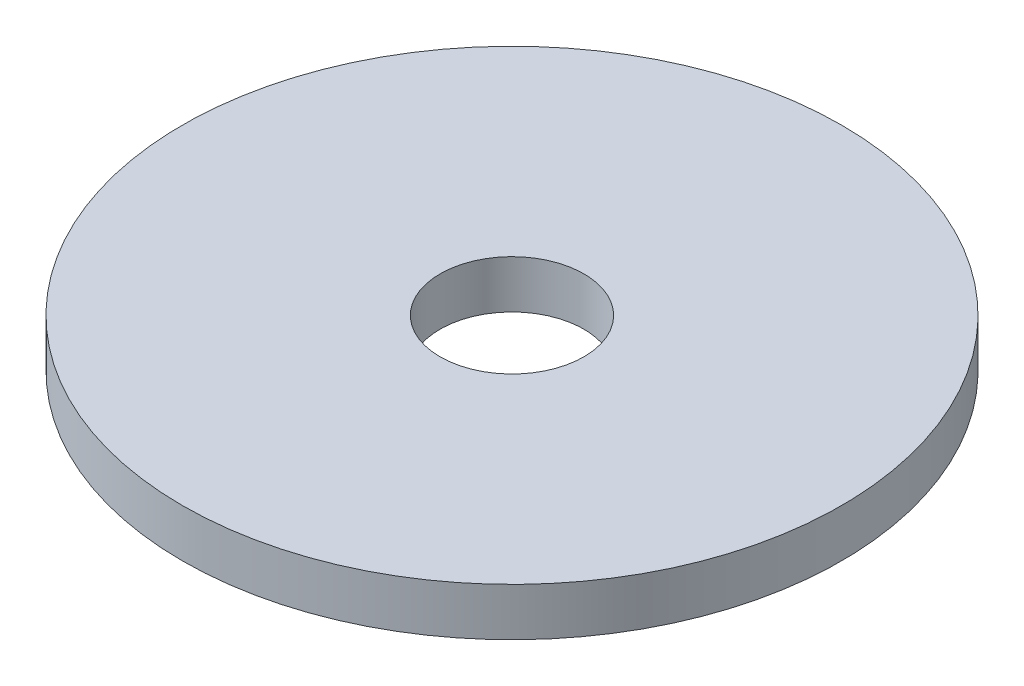
ISO-10303-21;
HEADER;
FILE_DESCRIPTION(('STEP AP214'),'2;1');
FILE_NAME('part.step','',(''),(''),'','','');
FILE_SCHEMA(('AUTOMOTIVE_DESIGN { 1 0 10303 214 1 1 1 1 }'));
ENDSEC;
DATA;
#1=APPLICATION_CONTEXT('core data for automotive mechanical design processes');
#2=APPLICATION_PROTOCOL_DEFINITION('international standard','automotive_design',2000,#1);
#3=PRODUCT_CONTEXT('',#1,'mechanical');
#4=PRODUCT('Part','Part','',(#3));
#5=PRODUCT_RELATED_PRODUCT_CATEGORY('part','',(#4));
#6=PRODUCT_DEFINITION_FORMATION('','',#4);
#7=PRODUCT_DEFINITION_CONTEXT('part definition',#1,'design');
#8=PRODUCT_DEFINITION('design','',#6,#7);
#9=PRODUCT_DEFINITION_SHAPE('','',#8);
#10=(LENGTH_UNIT() NAMED_UNIT(*) SI_UNIT(.MILLI.,.METRE.));
#11=(NAMED_UNIT(*) PLANE_ANGLE_UNIT() SI_UNIT($,.RADIAN.));
#12=(NAMED_UNIT(*) SI_UNIT($,.STERADIAN.) SOLID_ANGLE_UNIT());
#13=UNCERTAINTY_MEASURE_WITH_UNIT(LENGTH_MEASURE(1.E-05),#10,'distance_accuracy_value','');
#14=(GEOMETRIC_REPRESENTATION_CONTEXT(3) GLOBAL_UNCERTAINTY_ASSIGNED_CONTEXT((#13)) GLOBAL_UNIT_ASSIGNED_CONTEXT((#10,
#11,#12)) REPRESENTATION_CONTEXT('',''));
#15=CARTESIAN_POINT('',(0.,0.,0.));
#16=DIRECTION('',(0.,0.,1.));
#17=DIRECTION('',(1.,0.,0.));
#18=AXIS2_PLACEMENT_3D('',#15,#16,#17);
#19=CARTESIAN_POINT('',(0.,4.,0.));
#20=DIRECTION('',(0.,1.,0.));
#21=DIRECTION('',(0.,0.,1.));
#22=AXIS2_PLACEMENT_3D('',#19,#20,#21);
#23=PLANE('',#22);
#24=CARTESIAN_POINT('',(0.,4.,0.));
#25=DIRECTION('',(0.,1.,0.));
#26=DIRECTION('',(0.,0.,1.));
#27=AXIS2_PLACEMENT_3D('',#24,#25,#26);
#28=CIRCLE('',#27,27.5);
#29=CARTESIAN_POINT('',(0.,4.,27.5));
#30=VERTEX_POINT('',#29);
#31=EDGE_CURVE('E10',#30,#30,#28,.T.);
#32=ORIENTED_EDGE('',*,*,#31,.T.);
#33=EDGE_LOOP('',(#32));
#34=FACE_BOUND('',#33,.T.);
#35=CARTESIAN_POINT('',(0.,4.,0.));
#36=DIRECTION('',(0.,1.,0.));
#37=DIRECTION('',(0.,0.,1.));
#38=AXIS2_PLACEMENT_3D('',#35,#36,#37);
#39=CIRCLE('',#38,6.);
#40=CARTESIAN_POINT('',(0.,4.,6.));
#41=VERTEX_POINT('',#40);
#42=EDGE_CURVE('E50',#41,#41,#39,.T.);
#43=ORIENTED_EDGE('',*,*,#42,.F.);
#44=EDGE_LOOP('',(#43));
#45=FACE_BOUND('',#44,.T.);
#46=ADVANCED_FACE('F39',(#34,#45),#23,.T.);
#47=CARTESIAN_POINT('',(0.,0.,0.));
#48=DIRECTION('',(0.,1.,0.));
#49=DIRECTION('',(0.,0.,1.));
#50=AXIS2_PLACEMENT_3D('',#47,#48,#49);
#51=PLANE('',#50);
#52=CARTESIAN_POINT('',(0.,0.,0.));
#53=DIRECTION('',(0.,1.,0.));
#54=DIRECTION('',(0.,0.,1.));
#55=AXIS2_PLACEMENT_3D('',#52,#53,#54);
#56=CIRCLE('',#55,27.5);
#57=CARTESIAN_POINT('',(0.,0.,27.5));
#58=VERTEX_POINT('',#57);
#59=EDGE_CURVE('E43',#58,#58,#56,.T.);
#60=ORIENTED_EDGE('',*,*,#59,.F.);
#61=EDGE_LOOP('',(#60));
#62=FACE_BOUND('',#61,.T.);
#63=CARTESIAN_POINT('',(0.,0.,0.));
#64=DIRECTION('',(0.,1.,0.));
#65=DIRECTION('',(0.,0.,1.));
#66=AXIS2_PLACEMENT_3D('',#63,#64,#65);
#67=CIRCLE('',#66,6.);
#68=CARTESIAN_POINT('',(0.,0.,6.));
#69=VERTEX_POINT('',#68);
#70=EDGE_CURVE('E52',#69,#69,#67,.T.);
#71=ORIENTED_EDGE('',*,*,#70,.T.);
#72=EDGE_LOOP('',(#71));
#73=FACE_BOUND('',#72,.T.);
#74=ADVANCED_FACE('F62',(#62,#73),#51,.F.);
#75=CARTESIAN_POINT('',(0.,4.,0.));
#76=DIRECTION('',(0.,-1.,0.));
#77=DIRECTION('',(0.,0.,-1.));
#78=AXIS2_PLACEMENT_3D('',#75,#76,#77);
#79=CYLINDRICAL_SURFACE('',#78,27.5);
#80=ORIENTED_EDGE('',*,*,#31,.F.);
#81=EDGE_LOOP('',(#80));
#82=FACE_BOUND('',#81,.T.);
#83=ORIENTED_EDGE('',*,*,#59,.T.);
#84=EDGE_LOOP('',(#83));
#85=FACE_BOUND('',#84,.T.);
#86=ADVANCED_FACE('F41',(#82,#85),#79,.T.);
#87=CARTESIAN_POINT('',(0.,4.,0.));
#88=DIRECTION('',(0.,-1.,0.));
#89=DIRECTION('',(0.,0.,-1.));
#90=AXIS2_PLACEMENT_3D('',#87,#88,#89);
#91=CYLINDRICAL_SURFACE('',#90,6.);
#92=ORIENTED_EDGE('',*,*,#42,.T.);
#93=EDGE_LOOP('',(#92));
#94=FACE_BOUND('',#93,.T.);
#95=ORIENTED_EDGE('',*,*,#70,.F.);
#96=EDGE_LOOP('',(#95));
#97=FACE_BOUND('',#96,.T.);
#98=ADVANCED_FACE('F58',(#94,#97),#91,.F.);
#99=CLOSED_SHELL('',(#46,#74,#86,#98));
#100=MANIFOLD_SOLID_BREP('B2',#99);
#101=ADVANCED_BREP_SHAPE_REPRESENTATION('',(#18,#100),#14);
#102=SHAPE_DEFINITION_REPRESENTATION(#9,#101);
ENDSEC;
END-ISO-10303-21;
